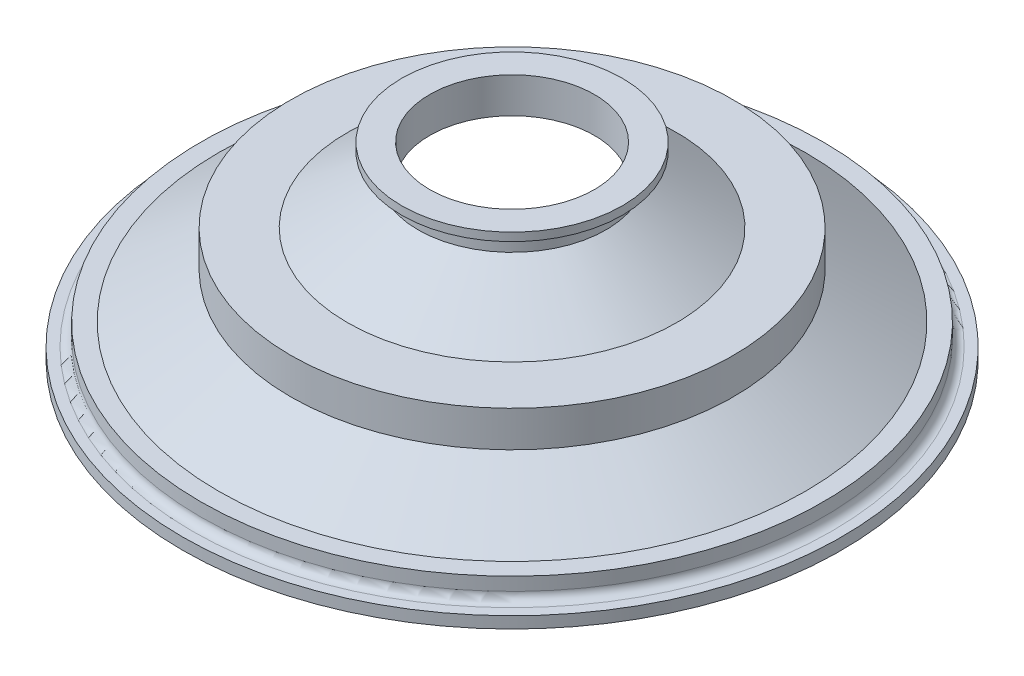
ISO-10303-21;
HEADER;
FILE_DESCRIPTION(('STEP AP214'),'2;1');
FILE_NAME('part.step','',(''),(''),'','','');
FILE_SCHEMA(('AUTOMOTIVE_DESIGN { 1 0 10303 214 1 1 1 1 }'));
ENDSEC;
DATA;
#1=APPLICATION_CONTEXT('core data for automotive mechanical design processes');
#2=APPLICATION_PROTOCOL_DEFINITION('international standard','automotive_design',2000,#1);
#3=PRODUCT_CONTEXT('',#1,'mechanical');
#4=PRODUCT('Part','Part','',(#3));
#5=PRODUCT_RELATED_PRODUCT_CATEGORY('part','',(#4));
#6=PRODUCT_DEFINITION_FORMATION('','',#4);
#7=PRODUCT_DEFINITION_CONTEXT('part definition',#1,'design');
#8=PRODUCT_DEFINITION('design','',#6,#7);
#9=PRODUCT_DEFINITION_SHAPE('','',#8);
#10=(LENGTH_UNIT() NAMED_UNIT(*) SI_UNIT(.MILLI.,.METRE.));
#11=(NAMED_UNIT(*) PLANE_ANGLE_UNIT() SI_UNIT($,.RADIAN.));
#12=(NAMED_UNIT(*) SI_UNIT($,.STERADIAN.) SOLID_ANGLE_UNIT());
#13=UNCERTAINTY_MEASURE_WITH_UNIT(LENGTH_MEASURE(1.E-05),#10,'distance_accuracy_value','');
#14=(GEOMETRIC_REPRESENTATION_CONTEXT(3) GLOBAL_UNCERTAINTY_ASSIGNED_CONTEXT((#13)) GLOBAL_UNIT_ASSIGNED_CONTEXT((#10,
#11,#12)) REPRESENTATION_CONTEXT('',''));
#15=CARTESIAN_POINT('',(0.,0.,0.));
#16=DIRECTION('',(0.,0.,1.));
#17=DIRECTION('',(1.,0.,0.));
#18=AXIS2_PLACEMENT_3D('',#15,#16,#17);
#19=CARTESIAN_POINT('',(0.,6.00000000000001,0.));
#20=DIRECTION('',(0.,1.,0.));
#21=DIRECTION('',(0.,0.,1.));
#22=AXIS2_PLACEMENT_3D('',#19,#20,#21);
#23=TOROIDAL_SURFACE('',#22,97.,6.);
#24=CARTESIAN_POINT('',(0.,0.,0.));
#25=DIRECTION('',(0.,1.,0.));
#26=DIRECTION('',(0.,0.,1.));
#27=AXIS2_PLACEMENT_3D('',#24,#25,#26);
#28=CIRCLE('',#27,97.);
#29=CARTESIAN_POINT('',(0.,0.,97.));
#30=VERTEX_POINT('',#29);
#31=EDGE_CURVE('E10',#30,#30,#28,.T.);
#32=ORIENTED_EDGE('',*,*,#31,.F.);
#33=EDGE_LOOP('',(#32));
#34=FACE_BOUND('',#33,.T.);
#35=CARTESIAN_POINT('',(0.,6.00000000000005,0.));
#36=DIRECTION('',(0.,1.,0.));
#37=DIRECTION('',(0.,0.,1.));
#38=AXIS2_PLACEMENT_3D('',#35,#36,#37);
#39=CIRCLE('',#38,91.);
#40=CARTESIAN_POINT('',(0.,6.00000000000005,91.));
#41=VERTEX_POINT('',#40);
#42=EDGE_CURVE('E109',#41,#41,#39,.T.);
#43=ORIENTED_EDGE('',*,*,#42,.T.);
#44=EDGE_LOOP('',(#43));
#45=FACE_BOUND('',#44,.T.);
#46=ADVANCED_FACE('F36',(#34,#45),#23,.T.);
#47=CARTESIAN_POINT('',(97.,0.,0.));
#48=DIRECTION('',(0.,1.,0.));
#49=DIRECTION('',(0.,0.,1.));
#50=AXIS2_PLACEMENT_3D('',#47,#48,#49);
#51=PLANE('',#50);
#52=CARTESIAN_POINT('',(0.,0.,0.));
#53=DIRECTION('',(0.,1.,0.));
#54=DIRECTION('',(0.,0.,1.));
#55=AXIS2_PLACEMENT_3D('',#52,#53,#54);
#56=CIRCLE('',#55,100.);
#57=CARTESIAN_POINT('',(0.,0.,100.));
#58=VERTEX_POINT('',#57);
#59=EDGE_CURVE('E42',#58,#58,#56,.T.);
#60=ORIENTED_EDGE('',*,*,#59,.F.);
#61=EDGE_LOOP('',(#60));
#62=FACE_BOUND('',#61,.T.);
#63=ORIENTED_EDGE('',*,*,#31,.T.);
#64=EDGE_LOOP('',(#63));
#65=FACE_BOUND('',#64,.T.);
#66=ADVANCED_FACE('F236',(#62,#65),#51,.F.);
#67=CARTESIAN_POINT('',(0.,60.1373344149213,0.));
#68=DIRECTION('',(0.,1.,0.));
#69=DIRECTION('',(0.,0.,1.));
#70=AXIS2_PLACEMENT_3D('',#67,#68,#69);
#71=CYLINDRICAL_SURFACE('',#70,100.);
#72=CARTESIAN_POINT('',(0.,3.50000000000001,0.));
#73=DIRECTION('',(0.,1.,0.));
#74=DIRECTION('',(0.,0.,1.));
#75=AXIS2_PLACEMENT_3D('',#72,#73,#74);
#76=CIRCLE('',#75,100.);
#77=CARTESIAN_POINT('',(0.,3.50000000000001,100.));
#78=VERTEX_POINT('',#77);
#79=EDGE_CURVE('E46',#78,#78,#76,.T.);
#80=ORIENTED_EDGE('',*,*,#79,.F.);
#81=EDGE_LOOP('',(#80));
#82=FACE_BOUND('',#81,.T.);
#83=ORIENTED_EDGE('',*,*,#59,.T.);
#84=EDGE_LOOP('',(#83));
#85=FACE_BOUND('',#84,.T.);
#86=ADVANCED_FACE('F231',(#82,#85),#71,.T.);
#87=CARTESIAN_POINT('',(97.,3.50000000000001,0.));
#88=DIRECTION('',(0.,-1.,0.));
#89=DIRECTION('',(0.,0.,-1.));
#90=AXIS2_PLACEMENT_3D('',#87,#88,#89);
#91=PLANE('',#90);
#92=CARTESIAN_POINT('',(0.,3.50000000000001,0.));
#93=DIRECTION('',(0.,1.,0.));
#94=DIRECTION('',(0.,0.,1.));
#95=AXIS2_PLACEMENT_3D('',#92,#93,#94);
#96=CIRCLE('',#95,97.);
#97=CARTESIAN_POINT('',(0.,3.50000000000001,97.));
#98=VERTEX_POINT('',#97);
#99=EDGE_CURVE('E50',#98,#98,#96,.T.);
#100=ORIENTED_EDGE('',*,*,#99,.F.);
#101=EDGE_LOOP('',(#100));
#102=FACE_BOUND('',#101,.T.);
#103=ORIENTED_EDGE('',*,*,#79,.T.);
#104=EDGE_LOOP('',(#103));
#105=FACE_BOUND('',#104,.T.);
#106=ADVANCED_FACE('F225',(#102,#105),#91,.F.);
#107=CARTESIAN_POINT('',(0.,6.00000000000001,0.));
#108=DIRECTION('',(0.,1.,0.));
#109=DIRECTION('',(0.,0.,1.));
#110=AXIS2_PLACEMENT_3D('',#107,#108,#109);
#111=TOROIDAL_SURFACE('',#110,97.,2.5);
#112=CARTESIAN_POINT('',(0.,6.00000000000003,0.));
#113=DIRECTION('',(0.,1.,0.));
#114=DIRECTION('',(0.,0.,1.));
#115=AXIS2_PLACEMENT_3D('',#112,#113,#114);
#116=CIRCLE('',#115,94.5);
#117=CARTESIAN_POINT('',(0.,6.00000000000003,94.5));
#118=VERTEX_POINT('',#117);
#119=EDGE_CURVE('E55',#118,#118,#116,.T.);
#120=ORIENTED_EDGE('',*,*,#119,.F.);
#121=EDGE_LOOP('',(#120));
#122=FACE_BOUND('',#121,.T.);
#123=ORIENTED_EDGE('',*,*,#99,.T.);
#124=EDGE_LOOP('',(#123));
#125=FACE_BOUND('',#124,.T.);
#126=ADVANCED_FACE('F219',(#122,#125),#111,.F.);
#127=CARTESIAN_POINT('',(0.,60.1373344149213,0.));
#128=DIRECTION('',(0.,1.,0.));
#129=DIRECTION('',(0.,0.,1.));
#130=AXIS2_PLACEMENT_3D('',#127,#128,#129);
#131=CYLINDRICAL_SURFACE('',#130,94.5);
#132=CARTESIAN_POINT('',(0.,10.,0.));
#133=DIRECTION('',(0.,1.,0.));
#134=DIRECTION('',(0.,0.,1.));
#135=AXIS2_PLACEMENT_3D('',#132,#133,#134);
#136=CIRCLE('',#135,94.5);
#137=CARTESIAN_POINT('',(0.,10.,94.5));
#138=VERTEX_POINT('',#137);
#139=EDGE_CURVE('E58',#138,#138,#136,.T.);
#140=ORIENTED_EDGE('',*,*,#139,.F.);
#141=EDGE_LOOP('',(#140));
#142=FACE_BOUND('',#141,.T.);
#143=ORIENTED_EDGE('',*,*,#119,.T.);
#144=EDGE_LOOP('',(#143));
#145=FACE_BOUND('',#144,.T.);
#146=ADVANCED_FACE('F213',(#142,#145),#131,.T.);
#147=CARTESIAN_POINT('',(89.017251622382,10.,0.));
#148=DIRECTION('',(0.,-1.,0.));
#149=DIRECTION('',(0.,0.,-1.));
#150=AXIS2_PLACEMENT_3D('',#147,#148,#149);
#151=PLANE('',#150);
#152=CARTESIAN_POINT('',(0.,10.,0.));
#153=DIRECTION('',(0.,1.,0.));
#154=DIRECTION('',(0.,0.,1.));
#155=AXIS2_PLACEMENT_3D('',#152,#153,#154);
#156=CIRCLE('',#155,89.017251622382);
#157=CARTESIAN_POINT('',(0.,10.,89.017251622382));
#158=VERTEX_POINT('',#157);
#159=EDGE_CURVE('E61',#158,#158,#156,.T.);
#160=ORIENTED_EDGE('',*,*,#159,.F.);
#161=EDGE_LOOP('',(#160));
#162=FACE_BOUND('',#161,.T.);
#163=ORIENTED_EDGE('',*,*,#139,.T.);
#164=EDGE_LOOP('',(#163));
#165=FACE_BOUND('',#164,.T.);
#166=ADVANCED_FACE('F207',(#162,#165),#151,.F.);
#167=CARTESIAN_POINT('',(0.,10.,0.));
#168=DIRECTION('',(0.,-1.,0.));
#169=DIRECTION('',(0.,0.,-1.));
#170=AXIS2_PLACEMENT_3D('',#167,#168,#169);
#171=CONICAL_SURFACE('',#170,89.017251622382,1.00509485813872);
#172=CARTESIAN_POINT('',(0.,23.8755341357356,0.));
#173=DIRECTION('',(0.,1.,0.));
#174=DIRECTION('',(0.,0.,1.));
#175=AXIS2_PLACEMENT_3D('',#172,#173,#174);
#176=CIRCLE('',#175,67.1632853585983);
#177=CARTESIAN_POINT('',(0.,23.8755341357356,67.1632853585983));
#178=VERTEX_POINT('',#177);
#179=EDGE_CURVE('E64',#178,#178,#176,.T.);
#180=ORIENTED_EDGE('',*,*,#179,.F.);
#181=EDGE_LOOP('',(#180));
#182=FACE_BOUND('',#181,.T.);
#183=ORIENTED_EDGE('',*,*,#159,.T.);
#184=EDGE_LOOP('',(#183));
#185=FACE_BOUND('',#184,.T.);
#186=ADVANCED_FACE('F201',(#182,#185),#171,.T.);
#187=CARTESIAN_POINT('',(0.,60.1373344149213,0.));
#188=DIRECTION('',(0.,1.,0.));
#189=DIRECTION('',(0.,0.,1.));
#190=AXIS2_PLACEMENT_3D('',#187,#188,#189);
#191=CYLINDRICAL_SURFACE('',#190,67.1632853585983);
#192=CARTESIAN_POINT('',(0.,34.7924272994566,0.));
#193=DIRECTION('',(0.,1.,0.));
#194=DIRECTION('',(0.,0.,1.));
#195=AXIS2_PLACEMENT_3D('',#192,#193,#194);
#196=CIRCLE('',#195,67.1632853585983);
#197=CARTESIAN_POINT('',(0.,34.7924272994566,67.1632853585983));
#198=VERTEX_POINT('',#197);
#199=EDGE_CURVE('E67',#198,#198,#196,.T.);
#200=ORIENTED_EDGE('',*,*,#199,.F.);
#201=EDGE_LOOP('',(#200));
#202=FACE_BOUND('',#201,.T.);
#203=ORIENTED_EDGE('',*,*,#179,.T.);
#204=EDGE_LOOP('',(#203));
#205=FACE_BOUND('',#204,.T.);
#206=ADVANCED_FACE('F195',(#202,#205),#191,.T.);
#207=CARTESIAN_POINT('',(67.1632853585983,34.7924272994566,0.));
#208=DIRECTION('',(0.,-1.,0.));
#209=DIRECTION('',(0.,0.,-1.));
#210=AXIS2_PLACEMENT_3D('',#207,#208,#209);
#211=PLANE('',#210);
#212=CARTESIAN_POINT('',(0.,34.7924272994566,0.));
#213=DIRECTION('',(0.,1.,0.));
#214=DIRECTION('',(0.,0.,1.));
#215=AXIS2_PLACEMENT_3D('',#212,#213,#214);
#216=CIRCLE('',#215,49.9691786257378);
#217=CARTESIAN_POINT('',(0.,34.7924272994566,49.9691786257378));
#218=VERTEX_POINT('',#217);
#219=EDGE_CURVE('E70',#218,#218,#216,.T.);
#220=ORIENTED_EDGE('',*,*,#219,.F.);
#221=EDGE_LOOP('',(#220));
#222=FACE_BOUND('',#221,.T.);
#223=ORIENTED_EDGE('',*,*,#199,.T.);
#224=EDGE_LOOP('',(#223));
#225=FACE_BOUND('',#224,.T.);
#226=ADVANCED_FACE('F189',(#222,#225),#211,.F.);
#227=CARTESIAN_POINT('',(0.,34.7924272994566,0.));
#228=DIRECTION('',(0.,-1.,0.));
#229=DIRECTION('',(0.,0.,-1.));
#230=AXIS2_PLACEMENT_3D('',#227,#228,#229);
#231=CONICAL_SURFACE('',#230,49.9691786257378,1.00509485813872);
#232=CARTESIAN_POINT('',(0.,48.4236518237346,0.));
#233=DIRECTION('',(0.,1.,0.));
#234=DIRECTION('',(0.,0.,1.));
#235=AXIS2_PLACEMENT_3D('',#232,#233,#234);
#236=CIRCLE('',#235,28.5);
#237=CARTESIAN_POINT('',(0.,48.4236518237346,28.5));
#238=VERTEX_POINT('',#237);
#239=EDGE_CURVE('E73',#238,#238,#236,.T.);
#240=ORIENTED_EDGE('',*,*,#239,.F.);
#241=EDGE_LOOP('',(#240));
#242=FACE_BOUND('',#241,.T.);
#243=ORIENTED_EDGE('',*,*,#219,.T.);
#244=EDGE_LOOP('',(#243));
#245=FACE_BOUND('',#244,.T.);
#246=ADVANCED_FACE('F183',(#242,#245),#231,.T.);
#247=CARTESIAN_POINT('',(0.,60.1373344149213,0.));
#248=DIRECTION('',(0.,1.,0.));
#249=DIRECTION('',(0.,0.,1.));
#250=AXIS2_PLACEMENT_3D('',#247,#248,#249);
#251=CYLINDRICAL_SURFACE('',#250,28.5);
#252=CARTESIAN_POINT('',(0.,54.7736518237346,0.));
#253=DIRECTION('',(0.,1.,0.));
#254=DIRECTION('',(0.,0.,1.));
#255=AXIS2_PLACEMENT_3D('',#252,#253,#254);
#256=CIRCLE('',#255,28.5);
#257=CARTESIAN_POINT('',(0.,54.7736518237346,28.5));
#258=VERTEX_POINT('',#257);
#259=EDGE_CURVE('E76',#258,#258,#256,.T.);
#260=ORIENTED_EDGE('',*,*,#259,.F.);
#261=EDGE_LOOP('',(#260));
#262=FACE_BOUND('',#261,.T.);
#263=ORIENTED_EDGE('',*,*,#239,.T.);
#264=EDGE_LOOP('',(#263));
#265=FACE_BOUND('',#264,.T.);
#266=ADVANCED_FACE('F177',(#262,#265),#251,.T.);
#267=CARTESIAN_POINT('',(33.5,54.7736518237346,0.));
#268=DIRECTION('',(0.,1.,0.));
#269=DIRECTION('',(0.,0.,1.));
#270=AXIS2_PLACEMENT_3D('',#267,#268,#269);
#271=PLANE('',#270);
#272=CARTESIAN_POINT('',(0.,54.7736518237346,0.));
#273=DIRECTION('',(0.,1.,0.));
#274=DIRECTION('',(0.,0.,1.));
#275=AXIS2_PLACEMENT_3D('',#272,#273,#274);
#276=CIRCLE('',#275,33.5);
#277=CARTESIAN_POINT('',(0.,54.7736518237346,33.5));
#278=VERTEX_POINT('',#277);
#279=EDGE_CURVE('E79',#278,#278,#276,.T.);
#280=ORIENTED_EDGE('',*,*,#279,.F.);
#281=EDGE_LOOP('',(#280));
#282=FACE_BOUND('',#281,.T.);
#283=ORIENTED_EDGE('',*,*,#259,.T.);
#284=EDGE_LOOP('',(#283));
#285=FACE_BOUND('',#284,.T.);
#286=ADVANCED_FACE('F171',(#282,#285),#271,.F.);
#287=CARTESIAN_POINT('',(0.,60.1373344149213,0.));
#288=DIRECTION('',(0.,1.,0.));
#289=DIRECTION('',(0.,0.,1.));
#290=AXIS2_PLACEMENT_3D('',#287,#288,#289);
#291=CYLINDRICAL_SURFACE('',#290,33.5);
#292=CARTESIAN_POINT('',(0.,57.2736518237346,0.));
#293=DIRECTION('',(0.,1.,0.));
#294=DIRECTION('',(0.,0.,1.));
#295=AXIS2_PLACEMENT_3D('',#292,#293,#294);
#296=CIRCLE('',#295,33.5);
#297=CARTESIAN_POINT('',(0.,57.2736518237346,33.5));
#298=VERTEX_POINT('',#297);
#299=EDGE_CURVE('E82',#298,#298,#296,.T.);
#300=ORIENTED_EDGE('',*,*,#299,.F.);
#301=EDGE_LOOP('',(#300));
#302=FACE_BOUND('',#301,.T.);
#303=ORIENTED_EDGE('',*,*,#279,.T.);
#304=EDGE_LOOP('',(#303));
#305=FACE_BOUND('',#304,.T.);
#306=ADVANCED_FACE('F165',(#302,#305),#291,.T.);
#307=CARTESIAN_POINT('',(25.,57.2736518237346,0.));
#308=DIRECTION('',(0.,-1.,0.));
#309=DIRECTION('',(0.,0.,-1.));
#310=AXIS2_PLACEMENT_3D('',#307,#308,#309);
#311=PLANE('',#310);
#312=CARTESIAN_POINT('',(0.,57.2736518237346,0.));
#313=DIRECTION('',(0.,1.,0.));
#314=DIRECTION('',(0.,0.,1.));
#315=AXIS2_PLACEMENT_3D('',#312,#313,#314);
#316=CIRCLE('',#315,25.);
#317=CARTESIAN_POINT('',(0.,57.2736518237346,25.));
#318=VERTEX_POINT('',#317);
#319=EDGE_CURVE('E85',#318,#318,#316,.T.);
#320=ORIENTED_EDGE('',*,*,#319,.F.);
#321=EDGE_LOOP('',(#320));
#322=FACE_BOUND('',#321,.T.);
#323=ORIENTED_EDGE('',*,*,#299,.T.);
#324=EDGE_LOOP('',(#323));
#325=FACE_BOUND('',#324,.T.);
#326=ADVANCED_FACE('F159',(#322,#325),#311,.F.);
#327=CARTESIAN_POINT('',(0.,60.1373344149213,0.));
#328=DIRECTION('',(0.,1.,0.));
#329=DIRECTION('',(0.,0.,1.));
#330=AXIS2_PLACEMENT_3D('',#327,#328,#329);
#331=CYLINDRICAL_SURFACE('',#330,25.);
#332=CARTESIAN_POINT('',(0.,46.5,0.));
#333=DIRECTION('',(0.,1.,0.));
#334=DIRECTION('',(0.,0.,1.));
#335=AXIS2_PLACEMENT_3D('',#332,#333,#334);
#336=CIRCLE('',#335,25.);
#337=CARTESIAN_POINT('',(0.,46.5,25.));
#338=VERTEX_POINT('',#337);
#339=EDGE_CURVE('E88',#338,#338,#336,.T.);
#340=ORIENTED_EDGE('',*,*,#339,.F.);
#341=EDGE_LOOP('',(#340));
#342=FACE_BOUND('',#341,.T.);
#343=ORIENTED_EDGE('',*,*,#319,.T.);
#344=EDGE_LOOP('',(#343));
#345=FACE_BOUND('',#344,.T.);
#346=ADVANCED_FACE('F153',(#342,#345),#331,.F.);
#347=CARTESIAN_POINT('',(0.,46.5,0.));
#348=DIRECTION('',(0.,-1.,0.));
#349=DIRECTION('',(0.,0.,-1.));
#350=AXIS2_PLACEMENT_3D('',#347,#348,#349);
#351=CONICAL_SURFACE('',#350,25.,1.00509485813872);
#352=CARTESIAN_POINT('',(0.,31.2924272994566,0.));
#353=DIRECTION('',(0.,1.,0.));
#354=DIRECTION('',(0.,0.,1.));
#355=AXIS2_PLACEMENT_3D('',#352,#353,#354);
#356=CIRCLE('',#355,48.9519270033558);
#357=CARTESIAN_POINT('',(0.,31.2924272994566,48.9519270033558));
#358=VERTEX_POINT('',#357);
#359=EDGE_CURVE('E91',#358,#358,#356,.T.);
#360=ORIENTED_EDGE('',*,*,#359,.F.);
#361=EDGE_LOOP('',(#360));
#362=FACE_BOUND('',#361,.T.);
#363=ORIENTED_EDGE('',*,*,#339,.T.);
#364=EDGE_LOOP('',(#363));
#365=FACE_BOUND('',#364,.T.);
#366=ADVANCED_FACE('F147',(#362,#365),#351,.F.);
#367=CARTESIAN_POINT('',(63.6632853585983,31.2924272994566,0.));
#368=DIRECTION('',(0.,1.,0.));
#369=DIRECTION('',(0.,0.,1.));
#370=AXIS2_PLACEMENT_3D('',#367,#368,#369);
#371=PLANE('',#370);
#372=CARTESIAN_POINT('',(0.,31.2924272994566,0.));
#373=DIRECTION('',(0.,1.,0.));
#374=DIRECTION('',(0.,0.,1.));
#375=AXIS2_PLACEMENT_3D('',#372,#373,#374);
#376=CIRCLE('',#375,63.6632853585983);
#377=CARTESIAN_POINT('',(0.,31.2924272994566,63.6632853585983));
#378=VERTEX_POINT('',#377);
#379=EDGE_CURVE('E94',#378,#378,#376,.T.);
#380=ORIENTED_EDGE('',*,*,#379,.F.);
#381=EDGE_LOOP('',(#380));
#382=FACE_BOUND('',#381,.T.);
#383=ORIENTED_EDGE('',*,*,#359,.T.);
#384=EDGE_LOOP('',(#383));
#385=FACE_BOUND('',#384,.T.);
#386=ADVANCED_FACE('F141',(#382,#385),#371,.F.);
#387=CARTESIAN_POINT('',(0.,60.1373344149213,0.));
#388=DIRECTION('',(0.,1.,0.));
#389=DIRECTION('',(0.,0.,1.));
#390=AXIS2_PLACEMENT_3D('',#387,#388,#389);
#391=CYLINDRICAL_SURFACE('',#390,63.6632853585983);
#392=CARTESIAN_POINT('',(0.,26.2924272994566,0.));
#393=DIRECTION('',(0.,1.,0.));
#394=DIRECTION('',(0.,0.,1.));
#395=AXIS2_PLACEMENT_3D('',#392,#393,#394);
#396=CIRCLE('',#395,63.6632853585983);
#397=CARTESIAN_POINT('',(0.,26.2924272994566,63.6632853585983));
#398=VERTEX_POINT('',#397);
#399=EDGE_CURVE('E97',#398,#398,#396,.T.);
#400=ORIENTED_EDGE('',*,*,#399,.F.);
#401=EDGE_LOOP('',(#400));
#402=FACE_BOUND('',#401,.T.);
#403=ORIENTED_EDGE('',*,*,#379,.T.);
#404=EDGE_LOOP('',(#403));
#405=FACE_BOUND('',#404,.T.);
#406=ADVANCED_FACE('F135',(#402,#405),#391,.F.);
#407=CARTESIAN_POINT('',(56.8269270033558,26.2924272994566,0.));
#408=DIRECTION('',(0.,-1.,0.));
#409=DIRECTION('',(0.,0.,-1.));
#410=AXIS2_PLACEMENT_3D('',#407,#408,#409);
#411=PLANE('',#410);
#412=CARTESIAN_POINT('',(0.,26.2924272994566,0.));
#413=DIRECTION('',(0.,1.,0.));
#414=DIRECTION('',(0.,0.,1.));
#415=AXIS2_PLACEMENT_3D('',#412,#413,#414);
#416=CIRCLE('',#415,56.8269270033558);
#417=CARTESIAN_POINT('',(0.,26.2924272994566,56.8269270033558));
#418=VERTEX_POINT('',#417);
#419=EDGE_CURVE('E100',#418,#418,#416,.T.);
#420=ORIENTED_EDGE('',*,*,#419,.F.);
#421=EDGE_LOOP('',(#420));
#422=FACE_BOUND('',#421,.T.);
#423=ORIENTED_EDGE('',*,*,#399,.T.);
#424=EDGE_LOOP('',(#423));
#425=FACE_BOUND('',#424,.T.);
#426=ADVANCED_FACE('F129',(#422,#425),#411,.F.);
#427=CARTESIAN_POINT('',(0.,26.2924272994566,0.));
#428=DIRECTION('',(0.,-1.,0.));
#429=DIRECTION('',(0.,0.,-1.));
#430=AXIS2_PLACEMENT_3D('',#427,#428,#429);
#431=CONICAL_SURFACE('',#430,56.8269270033558,1.00509485813872);
#432=CARTESIAN_POINT('',(0.,6.5,0.));
#433=DIRECTION('',(0.,1.,0.));
#434=DIRECTION('',(0.,0.,1.));
#435=AXIS2_PLACEMENT_3D('',#432,#433,#434);
#436=CIRCLE('',#435,88.);
#437=CARTESIAN_POINT('',(0.,6.5,88.));
#438=VERTEX_POINT('',#437);
#439=EDGE_CURVE('E103',#438,#438,#436,.T.);
#440=ORIENTED_EDGE('',*,*,#439,.F.);
#441=EDGE_LOOP('',(#440));
#442=FACE_BOUND('',#441,.T.);
#443=ORIENTED_EDGE('',*,*,#419,.T.);
#444=EDGE_LOOP('',(#443));
#445=FACE_BOUND('',#444,.T.);
#446=ADVANCED_FACE('F123',(#442,#445),#431,.F.);
#447=CARTESIAN_POINT('',(88.,6.5,0.));
#448=DIRECTION('',(0.,1.,0.));
#449=DIRECTION('',(0.,0.,1.));
#450=AXIS2_PLACEMENT_3D('',#447,#448,#449);
#451=PLANE('',#450);
#452=CARTESIAN_POINT('',(0.,6.5,0.));
#453=DIRECTION('',(0.,1.,0.));
#454=DIRECTION('',(0.,0.,1.));
#455=AXIS2_PLACEMENT_3D('',#452,#453,#454);
#456=CIRCLE('',#455,91.);
#457=CARTESIAN_POINT('',(0.,6.5,91.));
#458=VERTEX_POINT('',#457);
#459=EDGE_CURVE('E106',#458,#458,#456,.T.);
#460=ORIENTED_EDGE('',*,*,#459,.F.);
#461=EDGE_LOOP('',(#460));
#462=FACE_BOUND('',#461,.T.);
#463=ORIENTED_EDGE('',*,*,#439,.T.);
#464=EDGE_LOOP('',(#463));
#465=FACE_BOUND('',#464,.T.);
#466=ADVANCED_FACE('F117',(#462,#465),#451,.F.);
#467=CARTESIAN_POINT('',(0.,60.1373344149213,0.));
#468=DIRECTION('',(0.,1.,0.));
#469=DIRECTION('',(0.,0.,1.));
#470=AXIS2_PLACEMENT_3D('',#467,#468,#469);
#471=CYLINDRICAL_SURFACE('',#470,91.);
#472=ORIENTED_EDGE('',*,*,#42,.F.);
#473=EDGE_LOOP('',(#472));
#474=FACE_BOUND('',#473,.T.);
#475=ORIENTED_EDGE('',*,*,#459,.T.);
#476=EDGE_LOOP('',(#475));
#477=FACE_BOUND('',#476,.T.);
#478=ADVANCED_FACE('F114',(#474,#477),#471,.F.);
#479=CLOSED_SHELL('',(#46,#66,#86,#106,#126,#146,#166,#186,#206,#226,#246,#266,#286,#306,#326,
#346,#366,#386,#406,#426,#446,#466,#478));
#480=MANIFOLD_SOLID_BREP('B2',#479);
#481=ADVANCED_BREP_SHAPE_REPRESENTATION('',(#18,#480),#14);
#482=SHAPE_DEFINITION_REPRESENTATION(#9,#481);
ENDSEC;
END-ISO-10303-21;
